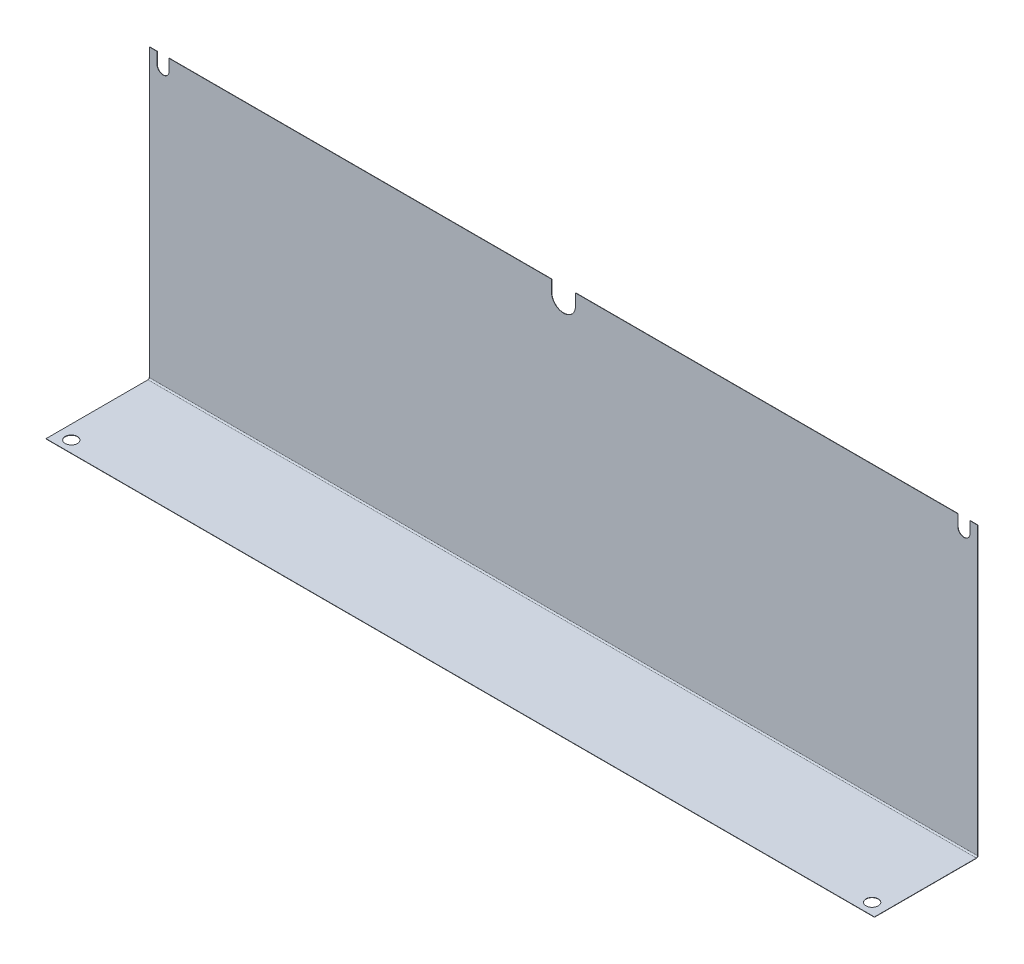
ISO-10303-21;
HEADER;
FILE_DESCRIPTION(('STEP AP214'),'2;1');
FILE_NAME('part.step','',(''),(''),'','','');
FILE_SCHEMA(('AUTOMOTIVE_DESIGN { 1 0 10303 214 1 1 1 1 }'));
ENDSEC;
DATA;
#1=APPLICATION_CONTEXT('core data for automotive mechanical design processes');
#2=APPLICATION_PROTOCOL_DEFINITION('international standard','automotive_design',2000,#1);
#3=PRODUCT_CONTEXT('',#1,'mechanical');
#4=PRODUCT('Part','Part','',(#3));
#5=PRODUCT_RELATED_PRODUCT_CATEGORY('part','',(#4));
#6=PRODUCT_DEFINITION_FORMATION('','',#4);
#7=PRODUCT_DEFINITION_CONTEXT('part definition',#1,'design');
#8=PRODUCT_DEFINITION('design','',#6,#7);
#9=PRODUCT_DEFINITION_SHAPE('','',#8);
#10=(LENGTH_UNIT() NAMED_UNIT(*) SI_UNIT(.MILLI.,.METRE.));
#11=(NAMED_UNIT(*) PLANE_ANGLE_UNIT() SI_UNIT($,.RADIAN.));
#12=(NAMED_UNIT(*) SI_UNIT($,.STERADIAN.) SOLID_ANGLE_UNIT());
#13=UNCERTAINTY_MEASURE_WITH_UNIT(LENGTH_MEASURE(1.E-05),#10,'distance_accuracy_value','');
#14=(GEOMETRIC_REPRESENTATION_CONTEXT(3) GLOBAL_UNCERTAINTY_ASSIGNED_CONTEXT((#13)) GLOBAL_UNIT_ASSIGNED_CONTEXT((#10,
#11,#12)) REPRESENTATION_CONTEXT('',''));
#15=CARTESIAN_POINT('',(0.,0.,0.));
#16=DIRECTION('',(0.,0.,1.));
#17=DIRECTION('',(1.,0.,0.));
#18=AXIS2_PLACEMENT_3D('',#15,#16,#17);
#19=CARTESIAN_POINT('',(457.2,158.75,-57.1500000000006));
#20=DIRECTION('',(0.,-1.,0.));
#21=DIRECTION('',(0.,0.,-1.));
#22=AXIS2_PLACEMENT_3D('',#19,#20,#21);
#23=PLANE('',#22);
#24=DIRECTION('',(1.,0.,0.));
#25=VECTOR('',#24,1.);
#26=CARTESIAN_POINT('',(0.,158.75,-57.1500000000006));
#27=LINE('',#26,#25);
#28=CARTESIAN_POINT('',(235.204,158.75,-57.1500000000006));
#29=VERTEX_POINT('',#28);
#30=CARTESIAN_POINT('',(446.278,158.75,-57.1500000000006));
#31=VERTEX_POINT('',#30);
#32=EDGE_CURVE('E267',#29,#31,#27,.T.);
#33=ORIENTED_EDGE('',*,*,#32,.F.);
#34=DIRECTION('',(0.,0.,-1.));
#35=VECTOR('',#34,1.);
#36=CARTESIAN_POINT('',(235.204,158.75,0.));
#37=LINE('',#36,#35);
#38=CARTESIAN_POINT('',(235.204,158.75,-56.9912500000006));
#39=VERTEX_POINT('',#38);
#40=EDGE_CURVE('E222',#39,#29,#37,.T.);
#41=ORIENTED_EDGE('',*,*,#40,.F.);
#42=DIRECTION('',(-1.,0.,0.));
#43=VECTOR('',#42,1.);
#44=CARTESIAN_POINT('',(457.2,158.75,-56.9912500000006));
#45=LINE('',#44,#43);
#46=CARTESIAN_POINT('',(446.278,158.75,-56.9912500000006));
#47=VERTEX_POINT('',#46);
#48=EDGE_CURVE('E278',#39,#47,#45,.F.);
#49=ORIENTED_EDGE('',*,*,#48,.T.);
#50=DIRECTION('',(0.,0.,-1.));
#51=VECTOR('',#50,1.);
#52=CARTESIAN_POINT('',(446.278,158.75,-57.1500000000006));
#53=LINE('',#52,#51);
#54=EDGE_CURVE('E335',#47,#31,#53,.T.);
#55=ORIENTED_EDGE('',*,*,#54,.T.);
#56=EDGE_LOOP('',(#33,#41,#49,#55));
#57=FACE_BOUND('',#56,.T.);
#58=ADVANCED_FACE('F57',(#57),#23,.F.);
#59=CARTESIAN_POINT('',(10.922,158.75,-56.9912500000006));
#60=VERTEX_POINT('',#59);
#61=CARTESIAN_POINT('',(221.996,158.75,-56.9912500000006));
#62=VERTEX_POINT('',#61);
#63=EDGE_CURVE('E277',#60,#62,#45,.F.);
#64=ORIENTED_EDGE('',*,*,#63,.T.);
#65=DIRECTION('',(0.,0.,-1.));
#66=VECTOR('',#65,1.);
#67=CARTESIAN_POINT('',(221.996,158.75,0.));
#68=LINE('',#67,#66);
#69=CARTESIAN_POINT('',(221.996,158.75,-57.1500000000006));
#70=VERTEX_POINT('',#69);
#71=EDGE_CURVE('E73',#62,#70,#68,.T.);
#72=ORIENTED_EDGE('',*,*,#71,.T.);
#73=CARTESIAN_POINT('',(10.922,158.75,-57.1500000000006));
#74=VERTEX_POINT('',#73);
#75=EDGE_CURVE('E215',#74,#70,#27,.T.);
#76=ORIENTED_EDGE('',*,*,#75,.F.);
#77=DIRECTION('',(0.,0.,1.));
#78=VECTOR('',#77,1.);
#79=CARTESIAN_POINT('',(10.922,158.75,-57.1500000000006));
#80=LINE('',#79,#78);
#81=EDGE_CURVE('E347',#74,#60,#80,.T.);
#82=ORIENTED_EDGE('',*,*,#81,.T.);
#83=EDGE_LOOP('',(#64,#72,#76,#82));
#84=FACE_BOUND('',#83,.T.);
#85=ADVANCED_FACE('F426',(#84),#23,.F.);
#86=CARTESIAN_POINT('',(452.882,158.75,-57.1500000000006));
#87=VERTEX_POINT('',#86);
#88=CARTESIAN_POINT('',(457.2,158.75,-57.1500000000006));
#89=VERTEX_POINT('',#88);
#90=EDGE_CURVE('E268',#87,#89,#27,.T.);
#91=ORIENTED_EDGE('',*,*,#90,.F.);
#92=DIRECTION('',(0.,0.,1.));
#93=VECTOR('',#92,1.);
#94=CARTESIAN_POINT('',(452.882,158.75,-57.1500000000006));
#95=LINE('',#94,#93);
#96=CARTESIAN_POINT('',(452.882,158.75,-56.9912500000006));
#97=VERTEX_POINT('',#96);
#98=EDGE_CURVE('E340',#87,#97,#95,.T.);
#99=ORIENTED_EDGE('',*,*,#98,.T.);
#100=CARTESIAN_POINT('',(457.2,158.75,-56.9912500000006));
#101=VERTEX_POINT('',#100);
#102=EDGE_CURVE('E279',#97,#101,#45,.F.);
#103=ORIENTED_EDGE('',*,*,#102,.T.);
#104=DIRECTION('',(0.,0.,1.));
#105=VECTOR('',#104,1.);
#106=CARTESIAN_POINT('',(457.2,158.75,-57.1500000000006));
#107=LINE('',#106,#105);
#108=EDGE_CURVE('E261',#89,#101,#107,.T.);
#109=ORIENTED_EDGE('',*,*,#108,.F.);
#110=EDGE_LOOP('',(#91,#99,#103,#109));
#111=FACE_BOUND('',#110,.T.);
#112=ADVANCED_FACE('F369',(#111),#23,.F.);
#113=CARTESIAN_POINT('',(0.,-0.15875,0.));
#114=DIRECTION('',(-1.,0.,0.));
#115=DIRECTION('',(0.,0.,1.));
#116=AXIS2_PLACEMENT_3D('',#113,#114,#115);
#117=PLANE('',#116);
#118=DIRECTION('',(0.,0.,1.));
#119=VECTOR('',#118,1.);
#120=CARTESIAN_POINT('',(0.,0.,0.));
#121=LINE('',#120,#119);
#122=CARTESIAN_POINT('',(0.,0.,-56.25465));
#123=VERTEX_POINT('',#122);
#124=CARTESIAN_POINT('',(0.,0.,0.));
#125=VERTEX_POINT('',#124);
#126=EDGE_CURVE('E314',#123,#125,#121,.T.);
#127=ORIENTED_EDGE('',*,*,#126,.F.);
#128=DIRECTION('',(0.,-1.,0.));
#129=VECTOR('',#128,1.);
#130=CARTESIAN_POINT('',(0.,0.,-56.25465));
#131=LINE('',#130,#129);
#132=CARTESIAN_POINT('',(0.,-0.158749999999981,-56.25465));
#133=VERTEX_POINT('',#132);
#134=EDGE_CURVE('E301',#123,#133,#131,.T.);
#135=ORIENTED_EDGE('',*,*,#134,.T.);
#136=DIRECTION('',(0.,0.,1.));
#137=VECTOR('',#136,1.);
#138=CARTESIAN_POINT('',(0.,-0.15875,0.));
#139=LINE('',#138,#137);
#140=CARTESIAN_POINT('',(0.,-0.15875,0.));
#141=VERTEX_POINT('',#140);
#142=EDGE_CURVE('E317',#133,#141,#139,.T.);
#143=ORIENTED_EDGE('',*,*,#142,.T.);
#144=DIRECTION('',(0.,1.,0.));
#145=VECTOR('',#144,1.);
#146=CARTESIAN_POINT('',(0.,-0.15875,0.));
#147=LINE('',#146,#145);
#148=EDGE_CURVE('E326',#141,#125,#147,.T.);
#149=ORIENTED_EDGE('',*,*,#148,.T.);
#150=EDGE_LOOP('',(#127,#135,#143,#149));
#151=FACE_BOUND('',#150,.T.);
#152=ADVANCED_FACE('F59',(#151),#117,.T.);
#153=CARTESIAN_POINT('',(0.,-0.15875,0.));
#154=DIRECTION('',(0.,-1.,0.));
#155=DIRECTION('',(0.,0.,-1.));
#156=AXIS2_PLACEMENT_3D('',#153,#154,#155);
#157=PLANE('',#156);
#158=CARTESIAN_POINT('',(7.62,-0.158750000000018,-6.35));
#159=DIRECTION('',(0.,-1.,0.));
#160=DIRECTION('',(0.,0.,-1.));
#161=AXIS2_PLACEMENT_3D('',#158,#159,#160);
#162=CIRCLE('',#161,3.37819999999999);
#163=CARTESIAN_POINT('',(7.62,-0.158750000000018,-9.72819999999999));
#164=VERTEX_POINT('',#163);
#165=EDGE_CURVE('E723',#164,#164,#162,.T.);
#166=ORIENTED_EDGE('',*,*,#165,.F.);
#167=EDGE_LOOP('',(#166));
#168=FACE_BOUND('',#167,.T.);
#169=CARTESIAN_POINT('',(449.58,-0.158750000000001,-6.35));
#170=DIRECTION('',(0.,-1.,0.));
#171=DIRECTION('',(0.,0.,-1.));
#172=AXIS2_PLACEMENT_3D('',#169,#170,#171);
#173=CIRCLE('',#172,3.3782);
#174=CARTESIAN_POINT('',(449.58,-0.158750000000001,-9.7282));
#175=VERTEX_POINT('',#174);
#176=EDGE_CURVE('E726',#175,#175,#173,.T.);
#177=ORIENTED_EDGE('',*,*,#176,.F.);
#178=EDGE_LOOP('',(#177));
#179=FACE_BOUND('',#178,.T.);
#180=ORIENTED_EDGE('',*,*,#142,.F.);
#181=DIRECTION('',(-1.,0.,0.));
#182=VECTOR('',#181,1.);
#183=CARTESIAN_POINT('',(0.,-0.158749999999981,-56.25465));
#184=LINE('',#183,#182);
#185=CARTESIAN_POINT('',(457.2,-0.15875,-56.25465));
#186=VERTEX_POINT('',#185);
#187=EDGE_CURVE('E294',#133,#186,#184,.F.);
#188=ORIENTED_EDGE('',*,*,#187,.T.);
#189=DIRECTION('',(0.,0.,-1.));
#190=VECTOR('',#189,1.);
#191=CARTESIAN_POINT('',(457.2,-0.15875,0.));
#192=LINE('',#191,#190);
#193=CARTESIAN_POINT('',(457.2,-0.15875,0.));
#194=VERTEX_POINT('',#193);
#195=EDGE_CURVE('E323',#194,#186,#192,.T.);
#196=ORIENTED_EDGE('',*,*,#195,.F.);
#197=DIRECTION('',(1.,0.,0.));
#198=VECTOR('',#197,1.);
#199=CARTESIAN_POINT('',(0.,-0.15875,0.));
#200=LINE('',#199,#198);
#201=EDGE_CURVE('E319',#141,#194,#200,.T.);
#202=ORIENTED_EDGE('',*,*,#201,.F.);
#203=EDGE_LOOP('',(#180,#188,#196,#202));
#204=FACE_BOUND('',#203,.T.);
#205=ADVANCED_FACE('F402',(#168,#179,#204),#157,.T.);
#206=CARTESIAN_POINT('',(0.,0.,0.));
#207=DIRECTION('',(0.,-1.,0.));
#208=DIRECTION('',(0.,0.,-1.));
#209=AXIS2_PLACEMENT_3D('',#206,#207,#208);
#210=PLANE('',#209);
#211=CARTESIAN_POINT('',(7.62,0.,-6.35));
#212=DIRECTION('',(0.,-1.,0.));
#213=DIRECTION('',(0.,0.,-1.));
#214=AXIS2_PLACEMENT_3D('',#211,#212,#213);
#215=CIRCLE('',#214,3.37819999999999);
#216=CARTESIAN_POINT('',(7.62,0.,-9.72819999999999));
#217=VERTEX_POINT('',#216);
#218=EDGE_CURVE('E725',#217,#217,#215,.T.);
#219=ORIENTED_EDGE('',*,*,#218,.T.);
#220=EDGE_LOOP('',(#219));
#221=FACE_BOUND('',#220,.T.);
#222=CARTESIAN_POINT('',(449.58,0.,-6.35));
#223=DIRECTION('',(0.,-1.,0.));
#224=DIRECTION('',(0.,0.,-1.));
#225=AXIS2_PLACEMENT_3D('',#222,#223,#224);
#226=CIRCLE('',#225,3.3782);
#227=CARTESIAN_POINT('',(449.58,0.,-9.7282));
#228=VERTEX_POINT('',#227);
#229=EDGE_CURVE('E61',#228,#228,#226,.T.);
#230=ORIENTED_EDGE('',*,*,#229,.T.);
#231=EDGE_LOOP('',(#230));
#232=FACE_BOUND('',#231,.T.);
#233=DIRECTION('',(-1.,0.,0.));
#234=VECTOR('',#233,1.);
#235=CARTESIAN_POINT('',(0.,0.,-56.25465));
#236=LINE('',#235,#234);
#237=CARTESIAN_POINT('',(457.2,0.,-56.25465));
#238=VERTEX_POINT('',#237);
#239=EDGE_CURVE('E307',#123,#238,#236,.F.);
#240=ORIENTED_EDGE('',*,*,#239,.F.);
#241=ORIENTED_EDGE('',*,*,#126,.T.);
#242=DIRECTION('',(1.,0.,0.));
#243=VECTOR('',#242,1.);
#244=CARTESIAN_POINT('',(0.,0.,0.));
#245=LINE('',#244,#243);
#246=CARTESIAN_POINT('',(457.2,0.,0.));
#247=VERTEX_POINT('',#246);
#248=EDGE_CURVE('E328',#125,#247,#245,.T.);
#249=ORIENTED_EDGE('',*,*,#248,.T.);
#250=DIRECTION('',(0.,0.,-1.));
#251=VECTOR('',#250,1.);
#252=CARTESIAN_POINT('',(457.2,0.,0.));
#253=LINE('',#252,#251);
#254=EDGE_CURVE('E320',#247,#238,#253,.T.);
#255=ORIENTED_EDGE('',*,*,#254,.T.);
#256=EDGE_LOOP('',(#240,#241,#249,#255));
#257=FACE_BOUND('',#256,.T.);
#258=ADVANCED_FACE('F412',(#221,#232,#257),#210,.F.);
#259=CARTESIAN_POINT('',(457.2,-0.15875,0.));
#260=DIRECTION('',(1.,0.,0.));
#261=DIRECTION('',(0.,0.,-1.));
#262=AXIS2_PLACEMENT_3D('',#259,#260,#261);
#263=PLANE('',#262);
#264=DIRECTION('',(0.,-1.,0.));
#265=VECTOR('',#264,1.);
#266=CARTESIAN_POINT('',(457.2,0.,-56.25465));
#267=LINE('',#266,#265);
#268=EDGE_CURVE('E311',#238,#186,#267,.T.);
#269=ORIENTED_EDGE('',*,*,#268,.F.);
#270=ORIENTED_EDGE('',*,*,#254,.F.);
#271=DIRECTION('',(0.,1.,0.));
#272=VECTOR('',#271,1.);
#273=CARTESIAN_POINT('',(457.2,-0.15875,0.));
#274=LINE('',#273,#272);
#275=EDGE_CURVE('E333',#194,#247,#274,.T.);
#276=ORIENTED_EDGE('',*,*,#275,.F.);
#277=ORIENTED_EDGE('',*,*,#195,.T.);
#278=EDGE_LOOP('',(#269,#270,#276,#277));
#279=FACE_BOUND('',#278,.T.);
#280=ADVANCED_FACE('F404',(#279),#263,.T.);
#281=CARTESIAN_POINT('',(0.,-0.15875,0.));
#282=DIRECTION('',(0.,0.,1.));
#283=DIRECTION('',(1.,0.,0.));
#284=AXIS2_PLACEMENT_3D('',#281,#282,#283);
#285=PLANE('',#284);
#286=ORIENTED_EDGE('',*,*,#248,.F.);
#287=ORIENTED_EDGE('',*,*,#148,.F.);
#288=ORIENTED_EDGE('',*,*,#201,.T.);
#289=ORIENTED_EDGE('',*,*,#275,.T.);
#290=EDGE_LOOP('',(#286,#287,#288,#289));
#291=FACE_BOUND('',#290,.T.);
#292=ADVANCED_FACE('F407',(#291),#285,.T.);
#293=CARTESIAN_POINT('',(457.2,0.736599999999982,-56.25465));
#294=DIRECTION('',(1.,0.,0.));
#295=DIRECTION('',(0.,1.,0.));
#296=AXIS2_PLACEMENT_3D('',#293,#294,#295);
#297=PLANE('',#296);
#298=DIRECTION('',(0.,0.,1.));
#299=VECTOR('',#298,1.);
#300=CARTESIAN_POINT('',(457.2,0.736599999999998,-57.15));
#301=LINE('',#300,#299);
#302=CARTESIAN_POINT('',(457.2,0.736599999999979,-56.99125));
#303=VERTEX_POINT('',#302);
#304=CARTESIAN_POINT('',(457.2,0.736599999999979,-57.15));
#305=VERTEX_POINT('',#304);
#306=EDGE_CURVE('E256',#303,#305,#301,.F.);
#307=ORIENTED_EDGE('',*,*,#306,.F.);
#308=CARTESIAN_POINT('',(457.2,0.736599999999982,-56.25465));
#309=DIRECTION('',(-1.,0.,0.));
#310=DIRECTION('',(0.,-1.,0.));
#311=AXIS2_PLACEMENT_3D('',#308,#309,#310);
#312=CIRCLE('',#311,0.736599999999997);
#313=EDGE_CURVE('E304',#238,#303,#312,.F.);
#314=ORIENTED_EDGE('',*,*,#313,.F.);
#315=ORIENTED_EDGE('',*,*,#268,.T.);
#316=CARTESIAN_POINT('',(457.2,0.736599999999982,-56.25465));
#317=DIRECTION('',(-1.,0.,0.));
#318=DIRECTION('',(0.,-1.,0.));
#319=AXIS2_PLACEMENT_3D('',#316,#317,#318);
#320=CIRCLE('',#319,0.895349999999997);
#321=EDGE_CURVE('E297',#186,#305,#320,.F.);
#322=ORIENTED_EDGE('',*,*,#321,.T.);
#323=EDGE_LOOP('',(#307,#314,#315,#322));
#324=FACE_BOUND('',#323,.T.);
#325=ADVANCED_FACE('F395',(#324),#297,.T.);
#326=CARTESIAN_POINT('',(0.,0.736600000000016,-56.25465));
#327=DIRECTION('',(1.,0.,0.));
#328=DIRECTION('',(0.,1.,0.));
#329=AXIS2_PLACEMENT_3D('',#326,#327,#328);
#330=PLANE('',#329);
#331=CARTESIAN_POINT('',(0.,0.736600000000016,-56.25465));
#332=DIRECTION('',(-1.,0.,0.));
#333=DIRECTION('',(0.,-1.,0.));
#334=AXIS2_PLACEMENT_3D('',#331,#332,#333);
#335=CIRCLE('',#334,0.736599999999997);
#336=CARTESIAN_POINT('',(0.,0.736600000000013,-56.99125));
#337=VERTEX_POINT('',#336);
#338=EDGE_CURVE('E260',#337,#123,#335,.T.);
#339=ORIENTED_EDGE('',*,*,#338,.F.);
#340=DIRECTION('',(0.,0.,1.));
#341=VECTOR('',#340,1.);
#342=CARTESIAN_POINT('',(0.,0.736600000000011,-56.99125));
#343=LINE('',#342,#341);
#344=CARTESIAN_POINT('',(0.,0.736600000000012,-57.15));
#345=VERTEX_POINT('',#344);
#346=EDGE_CURVE('E287',#337,#345,#343,.F.);
#347=ORIENTED_EDGE('',*,*,#346,.T.);
#348=CARTESIAN_POINT('',(0.,0.736600000000016,-56.25465));
#349=DIRECTION('',(-1.,0.,0.));
#350=DIRECTION('',(0.,-1.,0.));
#351=AXIS2_PLACEMENT_3D('',#348,#349,#350);
#352=CIRCLE('',#351,0.895349999999997);
#353=EDGE_CURVE('E298',#345,#133,#352,.T.);
#354=ORIENTED_EDGE('',*,*,#353,.T.);
#355=ORIENTED_EDGE('',*,*,#134,.F.);
#356=EDGE_LOOP('',(#339,#347,#354,#355));
#357=FACE_BOUND('',#356,.T.);
#358=ADVANCED_FACE('F385',(#357),#330,.F.);
#359=CARTESIAN_POINT('',(0.,0.736600000000016,-56.25465));
#360=DIRECTION('',(-1.,0.,0.));
#361=DIRECTION('',(0.,0.,-1.));
#362=AXIS2_PLACEMENT_3D('',#359,#360,#361);
#363=CYLINDRICAL_SURFACE('',#362,0.895349999999997);
#364=ORIENTED_EDGE('',*,*,#187,.F.);
#365=ORIENTED_EDGE('',*,*,#353,.F.);
#366=DIRECTION('',(-1.,0.,0.));
#367=VECTOR('',#366,1.);
#368=CARTESIAN_POINT('',(457.2,0.736599999999998,-57.15));
#369=LINE('',#368,#367);
#370=EDGE_CURVE('E285',#345,#305,#369,.F.);
#371=ORIENTED_EDGE('',*,*,#370,.T.);
#372=ORIENTED_EDGE('',*,*,#321,.F.);
#373=EDGE_LOOP('',(#364,#365,#371,#372));
#374=FACE_BOUND('',#373,.T.);
#375=ADVANCED_FACE('F393',(#374),#363,.T.);
#376=CARTESIAN_POINT('',(0.,0.736600000000016,-56.25465));
#377=DIRECTION('',(-1.,0.,0.));
#378=DIRECTION('',(0.,0.,-1.));
#379=AXIS2_PLACEMENT_3D('',#376,#377,#378);
#380=CYLINDRICAL_SURFACE('',#379,0.736599999999997);
#381=ORIENTED_EDGE('',*,*,#239,.T.);
#382=ORIENTED_EDGE('',*,*,#313,.T.);
#383=DIRECTION('',(-1.,0.,0.));
#384=VECTOR('',#383,1.);
#385=CARTESIAN_POINT('',(457.2,0.736599999999997,-56.99125));
#386=LINE('',#385,#384);
#387=EDGE_CURVE('E290',#303,#337,#386,.T.);
#388=ORIENTED_EDGE('',*,*,#387,.T.);
#389=ORIENTED_EDGE('',*,*,#338,.T.);
#390=EDGE_LOOP('',(#381,#382,#388,#389));
#391=FACE_BOUND('',#390,.T.);
#392=ADVANCED_FACE('F380',(#391),#380,.F.);
#393=CARTESIAN_POINT('',(457.2,0.,-57.15));
#394=DIRECTION('',(-1.,0.,0.));
#395=DIRECTION('',(0.,0.,1.));
#396=AXIS2_PLACEMENT_3D('',#393,#394,#395);
#397=PLANE('',#396);
#398=ORIENTED_EDGE('',*,*,#306,.T.);
#399=DIRECTION('',(0.,-1.,0.));
#400=VECTOR('',#399,1.);
#401=CARTESIAN_POINT('',(457.2,-2.0039441709507E-13,-57.15));
#402=LINE('',#401,#400);
#403=EDGE_CURVE('E271',#89,#305,#402,.T.);
#404=ORIENTED_EDGE('',*,*,#403,.F.);
#405=ORIENTED_EDGE('',*,*,#108,.T.);
#406=DIRECTION('',(0.,1.,0.));
#407=VECTOR('',#406,1.);
#408=CARTESIAN_POINT('',(457.2,0.,-56.99125));
#409=LINE('',#408,#407);
#410=EDGE_CURVE('E282',#101,#303,#409,.F.);
#411=ORIENTED_EDGE('',*,*,#410,.T.);
#412=EDGE_LOOP('',(#398,#404,#405,#411));
#413=FACE_BOUND('',#412,.T.);
#414=ADVANCED_FACE('F374',(#413),#397,.F.);
#415=CARTESIAN_POINT('',(0.,158.75,-57.1500000000006));
#416=DIRECTION('',(1.,0.,0.));
#417=DIRECTION('',(0.,0.,-1.));
#418=AXIS2_PLACEMENT_3D('',#415,#416,#417);
#419=PLANE('',#418);
#420=ORIENTED_EDGE('',*,*,#346,.F.);
#421=DIRECTION('',(0.,-1.,0.));
#422=VECTOR('',#421,1.);
#423=CARTESIAN_POINT('',(0.,158.75,-56.9912500000006));
#424=LINE('',#423,#422);
#425=CARTESIAN_POINT('',(0.,158.75,-56.9912500000006));
#426=VERTEX_POINT('',#425);
#427=EDGE_CURVE('E280',#337,#426,#424,.F.);
#428=ORIENTED_EDGE('',*,*,#427,.T.);
#429=DIRECTION('',(0.,0.,1.));
#430=VECTOR('',#429,1.);
#431=CARTESIAN_POINT('',(0.,158.75,-57.1500000000006));
#432=LINE('',#431,#430);
#433=CARTESIAN_POINT('',(0.,158.75,-57.1500000000006));
#434=VERTEX_POINT('',#433);
#435=EDGE_CURVE('E257',#434,#426,#432,.T.);
#436=ORIENTED_EDGE('',*,*,#435,.F.);
#437=DIRECTION('',(0.,1.,0.));
#438=VECTOR('',#437,1.);
#439=CARTESIAN_POINT('',(0.,-2.0039441709507E-13,-57.15));
#440=LINE('',#439,#438);
#441=EDGE_CURVE('E269',#345,#434,#440,.T.);
#442=ORIENTED_EDGE('',*,*,#441,.F.);
#443=EDGE_LOOP('',(#420,#428,#436,#442));
#444=FACE_BOUND('',#443,.T.);
#445=ADVANCED_FACE('F389',(#444),#419,.F.);
#446=CARTESIAN_POINT('',(0.,-2.0039441709507E-13,-57.15));
#447=DIRECTION('',(0.,0.,1.));
#448=DIRECTION('',(0.,-1.,0.));
#449=AXIS2_PLACEMENT_3D('',#446,#447,#448);
#450=PLANE('',#449);
#451=CARTESIAN_POINT('',(228.6,152.4,-57.1500000000005));
#452=DIRECTION('',(0.,0.,-1.));
#453=DIRECTION('',(0.,-1.,0.));
#454=AXIS2_PLACEMENT_3D('',#451,#452,#453);
#455=CIRCLE('',#454,6.604);
#456=CARTESIAN_POINT('',(235.204,152.4,-57.1500000000005));
#457=VERTEX_POINT('',#456);
#458=CARTESIAN_POINT('',(221.996,152.4,-57.1500000000005));
#459=VERTEX_POINT('',#458);
#460=EDGE_CURVE('E203',#457,#459,#455,.T.);
#461=ORIENTED_EDGE('',*,*,#460,.F.);
#462=DIRECTION('',(0.,-1.,0.));
#463=VECTOR('',#462,1.);
#464=CARTESIAN_POINT('',(235.204,152.4,-57.1500000000005));
#465=LINE('',#464,#463);
#466=EDGE_CURVE('E200',#29,#457,#465,.T.);
#467=ORIENTED_EDGE('',*,*,#466,.F.);
#468=ORIENTED_EDGE('',*,*,#32,.T.);
#469=DIRECTION('',(0.,1.,0.));
#470=VECTOR('',#469,1.);
#471=CARTESIAN_POINT('',(446.278,152.4,-57.1500000000005));
#472=LINE('',#471,#470);
#473=CARTESIAN_POINT('',(446.278,152.4,-57.1500000000005));
#474=VERTEX_POINT('',#473);
#475=EDGE_CURVE('E242',#474,#31,#472,.T.);
#476=ORIENTED_EDGE('',*,*,#475,.F.);
#477=CARTESIAN_POINT('',(449.58,152.4,-57.1500000000005));
#478=DIRECTION('',(0.,0.,-1.));
#479=DIRECTION('',(0.,1.,0.));
#480=AXIS2_PLACEMENT_3D('',#477,#478,#479);
#481=CIRCLE('',#480,3.30200000000005);
#482=CARTESIAN_POINT('',(452.882,152.4,-57.1500000000005));
#483=VERTEX_POINT('',#482);
#484=EDGE_CURVE('E239',#483,#474,#481,.T.);
#485=ORIENTED_EDGE('',*,*,#484,.F.);
#486=DIRECTION('',(0.,-1.,0.));
#487=VECTOR('',#486,1.);
#488=CARTESIAN_POINT('',(452.882,152.4,-57.1500000000005));
#489=LINE('',#488,#487);
#490=EDGE_CURVE('E245',#87,#483,#489,.T.);
#491=ORIENTED_EDGE('',*,*,#490,.F.);
#492=ORIENTED_EDGE('',*,*,#90,.T.);
#493=ORIENTED_EDGE('',*,*,#403,.T.);
#494=ORIENTED_EDGE('',*,*,#370,.F.);
#495=ORIENTED_EDGE('',*,*,#441,.T.);
#496=CARTESIAN_POINT('',(4.31799999999999,158.75,-57.1500000000006));
#497=VERTEX_POINT('',#496);
#498=EDGE_CURVE('E264',#434,#497,#27,.T.);
#499=ORIENTED_EDGE('',*,*,#498,.T.);
#500=DIRECTION('',(0.,1.,0.));
#501=VECTOR('',#500,1.);
#502=CARTESIAN_POINT('',(4.318,158.75,-57.1500000000006));
#503=LINE('',#502,#501);
#504=CARTESIAN_POINT('',(4.318,152.4,-57.1500000000005));
#505=VERTEX_POINT('',#504);
#506=EDGE_CURVE('E81',#505,#497,#503,.T.);
#507=ORIENTED_EDGE('',*,*,#506,.F.);
#508=CARTESIAN_POINT('',(7.62,152.4,-57.1500000000005));
#509=DIRECTION('',(0.,0.,-1.));
#510=DIRECTION('',(0.,1.,0.));
#511=AXIS2_PLACEMENT_3D('',#508,#509,#510);
#512=CIRCLE('',#511,3.302);
#513=CARTESIAN_POINT('',(10.922,152.4,-57.1500000000005));
#514=VERTEX_POINT('',#513);
#515=EDGE_CURVE('E221',#514,#505,#512,.T.);
#516=ORIENTED_EDGE('',*,*,#515,.F.);
#517=DIRECTION('',(0.,-1.,0.));
#518=VECTOR('',#517,1.);
#519=CARTESIAN_POINT('',(10.922,152.4,-57.1500000000005));
#520=LINE('',#519,#518);
#521=EDGE_CURVE('E228',#74,#514,#520,.T.);
#522=ORIENTED_EDGE('',*,*,#521,.F.);
#523=ORIENTED_EDGE('',*,*,#75,.T.);
#524=DIRECTION('',(0.,1.,0.));
#525=VECTOR('',#524,1.);
#526=CARTESIAN_POINT('',(221.996,158.75,-57.1500000000006));
#527=LINE('',#526,#525);
#528=EDGE_CURVE('E196',#459,#70,#527,.T.);
#529=ORIENTED_EDGE('',*,*,#528,.F.);
#530=EDGE_LOOP('',(#461,#467,#468,#476,#485,#491,#492,#493,#494,#495,#499,#507,#516,#522,#523,#529));
#531=FACE_BOUND('',#530,.T.);
#532=ADVANCED_FACE('F212',(#531),#450,.F.);
#533=CARTESIAN_POINT('',(0.,-1.99840144432528E-13,-56.99125));
#534=DIRECTION('',(0.,0.,1.));
#535=DIRECTION('',(0.,-1.,0.));
#536=AXIS2_PLACEMENT_3D('',#533,#534,#535);
#537=PLANE('',#536);
#538=DIRECTION('',(0.,1.,0.));
#539=VECTOR('',#538,1.);
#540=CARTESIAN_POINT('',(235.204,-1.99840144432528E-13,-56.99125));
#541=LINE('',#540,#539);
#542=CARTESIAN_POINT('',(235.204,152.4,-56.9912500000005));
#543=VERTEX_POINT('',#542);
#544=EDGE_CURVE('E13',#543,#39,#541,.T.);
#545=ORIENTED_EDGE('',*,*,#544,.F.);
#546=CARTESIAN_POINT('',(228.6,152.4,-56.9912500000005));
#547=DIRECTION('',(0.,0.,1.));
#548=DIRECTION('',(0.,-1.,0.));
#549=AXIS2_PLACEMENT_3D('',#546,#547,#548);
#550=CIRCLE('',#549,6.604);
#551=CARTESIAN_POINT('',(221.996,152.4,-56.9912500000005));
#552=VERTEX_POINT('',#551);
#553=EDGE_CURVE('E66',#552,#543,#550,.T.);
#554=ORIENTED_EDGE('',*,*,#553,.F.);
#555=DIRECTION('',(0.,-1.,0.));
#556=VECTOR('',#555,1.);
#557=CARTESIAN_POINT('',(221.996,-1.99840144432528E-13,-56.99125));
#558=LINE('',#557,#556);
#559=EDGE_CURVE('E197',#62,#552,#558,.T.);
#560=ORIENTED_EDGE('',*,*,#559,.F.);
#561=ORIENTED_EDGE('',*,*,#63,.F.);
#562=DIRECTION('',(0.,1.,0.));
#563=VECTOR('',#562,1.);
#564=CARTESIAN_POINT('',(10.922,-1.99840144432528E-13,-56.99125));
#565=LINE('',#564,#563);
#566=CARTESIAN_POINT('',(10.922,152.4,-56.9912500000005));
#567=VERTEX_POINT('',#566);
#568=EDGE_CURVE('E237',#567,#60,#565,.T.);
#569=ORIENTED_EDGE('',*,*,#568,.F.);
#570=CARTESIAN_POINT('',(7.62,152.4,-56.9912500000005));
#571=DIRECTION('',(0.,0.,1.));
#572=DIRECTION('',(0.,-1.,0.));
#573=AXIS2_PLACEMENT_3D('',#570,#571,#572);
#574=CIRCLE('',#573,3.302);
#575=CARTESIAN_POINT('',(4.318,152.4,-56.9912500000005));
#576=VERTEX_POINT('',#575);
#577=EDGE_CURVE('E350',#576,#567,#574,.T.);
#578=ORIENTED_EDGE('',*,*,#577,.F.);
#579=DIRECTION('',(0.,-1.,0.));
#580=VECTOR('',#579,1.);
#581=CARTESIAN_POINT('',(4.318,-1.99840144432528E-13,-56.99125));
#582=LINE('',#581,#580);
#583=CARTESIAN_POINT('',(4.318,158.75,-56.9912500000006));
#584=VERTEX_POINT('',#583);
#585=EDGE_CURVE('E234',#584,#576,#582,.T.);
#586=ORIENTED_EDGE('',*,*,#585,.F.);
#587=EDGE_CURVE('E274',#426,#584,#45,.F.);
#588=ORIENTED_EDGE('',*,*,#587,.F.);
#589=ORIENTED_EDGE('',*,*,#427,.F.);
#590=ORIENTED_EDGE('',*,*,#387,.F.);
#591=ORIENTED_EDGE('',*,*,#410,.F.);
#592=ORIENTED_EDGE('',*,*,#102,.F.);
#593=DIRECTION('',(0.,1.,0.));
#594=VECTOR('',#593,1.);
#595=CARTESIAN_POINT('',(452.882000000001,3.7592151613808E-12,-56.99125));
#596=LINE('',#595,#594);
#597=CARTESIAN_POINT('',(452.882,152.4,-56.9912500000005));
#598=VERTEX_POINT('',#597);
#599=EDGE_CURVE('E254',#598,#97,#596,.T.);
#600=ORIENTED_EDGE('',*,*,#599,.F.);
#601=CARTESIAN_POINT('',(449.58,152.4,-56.9912500000005));
#602=DIRECTION('',(0.,0.,1.));
#603=DIRECTION('',(0.,-1.,0.));
#604=AXIS2_PLACEMENT_3D('',#601,#602,#603);
#605=CIRCLE('',#604,3.30200000000005);
#606=CARTESIAN_POINT('',(446.278,152.4,-56.9912500000005));
#607=VERTEX_POINT('',#606);
#608=EDGE_CURVE('E343',#607,#598,#605,.T.);
#609=ORIENTED_EDGE('',*,*,#608,.F.);
#610=DIRECTION('',(0.,-1.,0.));
#611=VECTOR('',#610,1.);
#612=CARTESIAN_POINT('',(446.278,-1.99840144432528E-13,-56.99125));
#613=LINE('',#612,#611);
#614=EDGE_CURVE('E251',#47,#607,#613,.T.);
#615=ORIENTED_EDGE('',*,*,#614,.F.);
#616=ORIENTED_EDGE('',*,*,#48,.F.);
#617=EDGE_LOOP('',(#545,#554,#560,#561,#569,#578,#586,#588,#589,#590,#591,#592,#600,#609,#615,#616));
#618=FACE_BOUND('',#617,.T.);
#619=ADVANCED_FACE('F359',(#618),#537,.T.);
#620=ORIENTED_EDGE('',*,*,#587,.T.);
#621=DIRECTION('',(0.,0.,-1.));
#622=VECTOR('',#621,1.);
#623=CARTESIAN_POINT('',(4.31799999999999,158.75,-57.1500000000006));
#624=LINE('',#623,#622);
#625=EDGE_CURVE('E345',#584,#497,#624,.T.);
#626=ORIENTED_EDGE('',*,*,#625,.T.);
#627=ORIENTED_EDGE('',*,*,#498,.F.);
#628=ORIENTED_EDGE('',*,*,#435,.T.);
#629=EDGE_LOOP('',(#620,#626,#627,#628));
#630=FACE_BOUND('',#629,.T.);
#631=ADVANCED_FACE('F428',(#630),#23,.F.);
#632=CARTESIAN_POINT('',(449.58,152.4,0.));
#633=DIRECTION('',(0.,0.,-1.));
#634=DIRECTION('',(0.,1.,0.));
#635=AXIS2_PLACEMENT_3D('',#632,#633,#634);
#636=CYLINDRICAL_SURFACE('',#635,3.30200000000005);
#637=ORIENTED_EDGE('',*,*,#608,.T.);
#638=DIRECTION('',(0.,0.,-1.));
#639=VECTOR('',#638,1.);
#640=CARTESIAN_POINT('',(452.882,152.4,0.));
#641=LINE('',#640,#639);
#642=EDGE_CURVE('E249',#598,#483,#641,.T.);
#643=ORIENTED_EDGE('',*,*,#642,.T.);
#644=ORIENTED_EDGE('',*,*,#484,.T.);
#645=DIRECTION('',(0.,0.,-1.));
#646=VECTOR('',#645,1.);
#647=CARTESIAN_POINT('',(446.278,152.4,0.));
#648=LINE('',#647,#646);
#649=EDGE_CURVE('E248',#607,#474,#648,.T.);
#650=ORIENTED_EDGE('',*,*,#649,.F.);
#651=EDGE_LOOP('',(#637,#643,#644,#650));
#652=FACE_BOUND('',#651,.T.);
#653=ADVANCED_FACE('F437',(#652),#636,.F.);
#654=CARTESIAN_POINT('',(452.882,152.4,0.));
#655=DIRECTION('',(1.,0.,0.));
#656=DIRECTION('',(0.,1.,0.));
#657=AXIS2_PLACEMENT_3D('',#654,#655,#656);
#658=PLANE('',#657);
#659=ORIENTED_EDGE('',*,*,#599,.T.);
#660=ORIENTED_EDGE('',*,*,#98,.F.);
#661=ORIENTED_EDGE('',*,*,#490,.T.);
#662=ORIENTED_EDGE('',*,*,#642,.F.);
#663=EDGE_LOOP('',(#659,#660,#661,#662));
#664=FACE_BOUND('',#663,.T.);
#665=ADVANCED_FACE('F443',(#664),#658,.F.);
#666=CARTESIAN_POINT('',(446.278,152.4,0.));
#667=DIRECTION('',(-1.,0.,0.));
#668=DIRECTION('',(0.,0.,1.));
#669=AXIS2_PLACEMENT_3D('',#666,#667,#668);
#670=PLANE('',#669);
#671=ORIENTED_EDGE('',*,*,#614,.T.);
#672=ORIENTED_EDGE('',*,*,#649,.T.);
#673=ORIENTED_EDGE('',*,*,#475,.T.);
#674=ORIENTED_EDGE('',*,*,#54,.F.);
#675=EDGE_LOOP('',(#671,#672,#673,#674));
#676=FACE_BOUND('',#675,.T.);
#677=ADVANCED_FACE('F510',(#676),#670,.F.);
#678=CARTESIAN_POINT('',(7.62,152.4,0.));
#679=DIRECTION('',(0.,0.,-1.));
#680=DIRECTION('',(0.,1.,0.));
#681=AXIS2_PLACEMENT_3D('',#678,#679,#680);
#682=CYLINDRICAL_SURFACE('',#681,3.302);
#683=ORIENTED_EDGE('',*,*,#577,.T.);
#684=DIRECTION('',(0.,0.,-1.));
#685=VECTOR('',#684,1.);
#686=CARTESIAN_POINT('',(10.922,152.4,0.));
#687=LINE('',#686,#685);
#688=EDGE_CURVE('E232',#567,#514,#687,.T.);
#689=ORIENTED_EDGE('',*,*,#688,.T.);
#690=ORIENTED_EDGE('',*,*,#515,.T.);
#691=DIRECTION('',(0.,0.,-1.));
#692=VECTOR('',#691,1.);
#693=CARTESIAN_POINT('',(4.318,152.4,0.));
#694=LINE('',#693,#692);
#695=EDGE_CURVE('E231',#576,#505,#694,.T.);
#696=ORIENTED_EDGE('',*,*,#695,.F.);
#697=EDGE_LOOP('',(#683,#689,#690,#696));
#698=FACE_BOUND('',#697,.T.);
#699=ADVANCED_FACE('F504',(#698),#682,.F.);
#700=CARTESIAN_POINT('',(10.922,152.4,0.));
#701=DIRECTION('',(1.,0.,0.));
#702=DIRECTION('',(0.,0.,-1.));
#703=AXIS2_PLACEMENT_3D('',#700,#701,#702);
#704=PLANE('',#703);
#705=ORIENTED_EDGE('',*,*,#568,.T.);
#706=ORIENTED_EDGE('',*,*,#81,.F.);
#707=ORIENTED_EDGE('',*,*,#521,.T.);
#708=ORIENTED_EDGE('',*,*,#688,.F.);
#709=EDGE_LOOP('',(#705,#706,#707,#708));
#710=FACE_BOUND('',#709,.T.);
#711=ADVANCED_FACE('F501',(#710),#704,.F.);
#712=CARTESIAN_POINT('',(4.318,158.75,0.));
#713=DIRECTION('',(-1.,0.,0.));
#714=DIRECTION('',(0.,0.,1.));
#715=AXIS2_PLACEMENT_3D('',#712,#713,#714);
#716=PLANE('',#715);
#717=ORIENTED_EDGE('',*,*,#585,.T.);
#718=ORIENTED_EDGE('',*,*,#695,.T.);
#719=ORIENTED_EDGE('',*,*,#506,.T.);
#720=ORIENTED_EDGE('',*,*,#625,.F.);
#721=EDGE_LOOP('',(#717,#718,#719,#720));
#722=FACE_BOUND('',#721,.T.);
#723=ADVANCED_FACE('F500',(#722),#716,.F.);
#724=CARTESIAN_POINT('',(228.6,152.4,0.));
#725=DIRECTION('',(0.,0.,-1.));
#726=DIRECTION('',(0.,1.,0.));
#727=AXIS2_PLACEMENT_3D('',#724,#725,#726);
#728=CYLINDRICAL_SURFACE('',#727,6.604);
#729=ORIENTED_EDGE('',*,*,#553,.T.);
#730=DIRECTION('',(0.,0.,-1.));
#731=VECTOR('',#730,1.);
#732=CARTESIAN_POINT('',(235.204,152.4,0.));
#733=LINE('',#732,#731);
#734=EDGE_CURVE('E206',#543,#457,#733,.T.);
#735=ORIENTED_EDGE('',*,*,#734,.T.);
#736=ORIENTED_EDGE('',*,*,#460,.T.);
#737=DIRECTION('',(0.,0.,-1.));
#738=VECTOR('',#737,1.);
#739=CARTESIAN_POINT('',(221.996,152.4,0.));
#740=LINE('',#739,#738);
#741=EDGE_CURVE('E192',#552,#459,#740,.T.);
#742=ORIENTED_EDGE('',*,*,#741,.F.);
#743=EDGE_LOOP('',(#729,#735,#736,#742));
#744=FACE_BOUND('',#743,.T.);
#745=ADVANCED_FACE('F204',(#744),#728,.F.);
#746=CARTESIAN_POINT('',(235.204,152.4,0.));
#747=DIRECTION('',(1.,0.,0.));
#748=DIRECTION('',(0.,0.,-1.));
#749=AXIS2_PLACEMENT_3D('',#746,#747,#748);
#750=PLANE('',#749);
#751=ORIENTED_EDGE('',*,*,#544,.T.);
#752=ORIENTED_EDGE('',*,*,#40,.T.);
#753=ORIENTED_EDGE('',*,*,#466,.T.);
#754=ORIENTED_EDGE('',*,*,#734,.F.);
#755=EDGE_LOOP('',(#751,#752,#753,#754));
#756=FACE_BOUND('',#755,.T.);
#757=ADVANCED_FACE('F356',(#756),#750,.F.);
#758=CARTESIAN_POINT('',(221.996,158.75,0.));
#759=DIRECTION('',(-1.,0.,0.));
#760=DIRECTION('',(0.,0.,1.));
#761=AXIS2_PLACEMENT_3D('',#758,#759,#760);
#762=PLANE('',#761);
#763=ORIENTED_EDGE('',*,*,#559,.T.);
#764=ORIENTED_EDGE('',*,*,#741,.T.);
#765=ORIENTED_EDGE('',*,*,#528,.T.);
#766=ORIENTED_EDGE('',*,*,#71,.F.);
#767=EDGE_LOOP('',(#763,#764,#765,#766));
#768=FACE_BOUND('',#767,.T.);
#769=ADVANCED_FACE('F194',(#768),#762,.F.);
#770=CARTESIAN_POINT('',(449.58,-0.15875,-6.35));
#771=DIRECTION('',(0.,-1.,0.));
#772=DIRECTION('',(0.,0.,-1.));
#773=AXIS2_PLACEMENT_3D('',#770,#771,#772);
#774=CYLINDRICAL_SURFACE('',#773,3.3782);
#775=ORIENTED_EDGE('',*,*,#176,.T.);
#776=EDGE_LOOP('',(#775));
#777=FACE_BOUND('',#776,.T.);
#778=ORIENTED_EDGE('',*,*,#229,.F.);
#779=EDGE_LOOP('',(#778));
#780=FACE_BOUND('',#779,.T.);
#781=ADVANCED_FACE('F473',(#777,#780),#774,.F.);
#782=CARTESIAN_POINT('',(7.62,-0.158750000000017,-6.35));
#783=DIRECTION('',(0.,-1.,0.));
#784=DIRECTION('',(0.,0.,-1.));
#785=AXIS2_PLACEMENT_3D('',#782,#783,#784);
#786=CYLINDRICAL_SURFACE('',#785,3.37819999999999);
#787=ORIENTED_EDGE('',*,*,#165,.T.);
#788=EDGE_LOOP('',(#787));
#789=FACE_BOUND('',#788,.T.);
#790=ORIENTED_EDGE('',*,*,#218,.F.);
#791=EDGE_LOOP('',(#790));
#792=FACE_BOUND('',#791,.T.);
#793=ADVANCED_FACE('F478',(#789,#792),#786,.F.);
#794=CLOSED_SHELL('',(#58,#85,#112,#152,#205,#258,#280,#292,#325,#358,#375,#392,#414,#445,#532,
#619,#631,#653,#665,#677,#699,#711,#723,#745,#757,#769,#781,#793));
#795=MANIFOLD_SOLID_BREP('B2',#794);
#796=ADVANCED_BREP_SHAPE_REPRESENTATION('',(#18,#795),#14);
#797=SHAPE_DEFINITION_REPRESENTATION(#9,#796);
ENDSEC;
END-ISO-10303-21;
